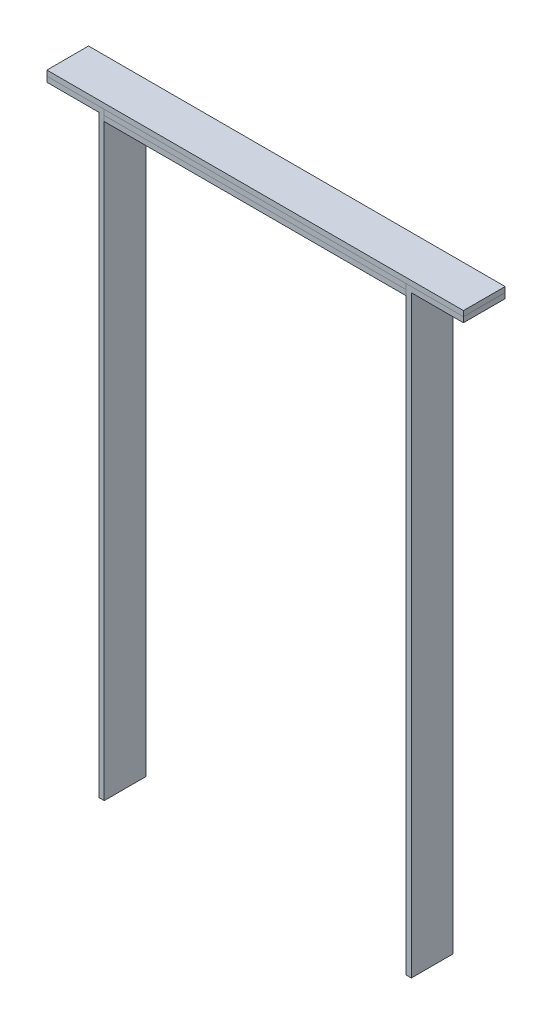
ISO-10303-21;
HEADER;
FILE_DESCRIPTION(('STEP AP214'),'2;1');
FILE_NAME('part.step','',(''),(''),'','','');
FILE_SCHEMA(('AUTOMOTIVE_DESIGN { 1 0 10303 214 1 1 1 1 }'));
ENDSEC;
DATA;
#1=APPLICATION_CONTEXT('core data for automotive mechanical design processes');
#2=APPLICATION_PROTOCOL_DEFINITION('international standard','automotive_design',2000,#1);
#3=PRODUCT_CONTEXT('',#1,'mechanical');
#4=PRODUCT('Part','Part','',(#3));
#5=PRODUCT_RELATED_PRODUCT_CATEGORY('part','',(#4));
#6=PRODUCT_DEFINITION_FORMATION('','',#4);
#7=PRODUCT_DEFINITION_CONTEXT('part definition',#1,'design');
#8=PRODUCT_DEFINITION('design','',#6,#7);
#9=PRODUCT_DEFINITION_SHAPE('','',#8);
#10=(LENGTH_UNIT() NAMED_UNIT(*) SI_UNIT(.MILLI.,.METRE.));
#11=(NAMED_UNIT(*) PLANE_ANGLE_UNIT() SI_UNIT($,.RADIAN.));
#12=(NAMED_UNIT(*) SI_UNIT($,.STERADIAN.) SOLID_ANGLE_UNIT());
#13=UNCERTAINTY_MEASURE_WITH_UNIT(LENGTH_MEASURE(1.E-05),#10,'distance_accuracy_value','');
#14=(GEOMETRIC_REPRESENTATION_CONTEXT(3) GLOBAL_UNCERTAINTY_ASSIGNED_CONTEXT((#13)) GLOBAL_UNIT_ASSIGNED_CONTEXT((#10,
#11,#12)) REPRESENTATION_CONTEXT('',''));
#15=CARTESIAN_POINT('',(0.,0.,0.));
#16=DIRECTION('',(0.,0.,1.));
#17=DIRECTION('',(1.,0.,0.));
#18=AXIS2_PLACEMENT_3D('',#15,#16,#17);
#19=CARTESIAN_POINT('',(1.27,0.,10.));
#20=DIRECTION('',(1.,0.,0.));
#21=DIRECTION('',(0.,1.,0.));
#22=AXIS2_PLACEMENT_3D('',#19,#20,#21);
#23=PLANE('',#22);
#24=DIRECTION('',(0.,-1.,0.));
#25=VECTOR('',#24,1.);
#26=CARTESIAN_POINT('',(1.27,0.,0.));
#27=LINE('',#26,#25);
#28=CARTESIAN_POINT('',(1.26999999999998,142.46,0.));
#29=VERTEX_POINT('',#28);
#30=CARTESIAN_POINT('',(1.26999999999998,141.19,0.));
#31=VERTEX_POINT('',#30);
#32=EDGE_CURVE('E115',#29,#31,#27,.T.);
#33=ORIENTED_EDGE('',*,*,#32,.T.);
#34=DIRECTION('',(0.,0.,-1.));
#35=VECTOR('',#34,1.);
#36=CARTESIAN_POINT('',(1.26999999999998,141.19,10.));
#37=LINE('',#36,#35);
#38=CARTESIAN_POINT('',(1.26999999999998,141.19,10.));
#39=VERTEX_POINT('',#38);
#40=EDGE_CURVE('E12',#39,#31,#37,.T.);
#41=ORIENTED_EDGE('',*,*,#40,.F.);
#42=DIRECTION('',(0.,-1.,0.));
#43=VECTOR('',#42,1.);
#44=CARTESIAN_POINT('',(1.27,0.,10.));
#45=LINE('',#44,#43);
#46=CARTESIAN_POINT('',(1.26999999999998,142.46,10.));
#47=VERTEX_POINT('',#46);
#48=EDGE_CURVE('E101',#47,#39,#45,.T.);
#49=ORIENTED_EDGE('',*,*,#48,.F.);
#50=DIRECTION('',(0.,0.,-1.));
#51=VECTOR('',#50,1.);
#52=CARTESIAN_POINT('',(1.26999999999998,142.46,10.));
#53=LINE('',#52,#51);
#54=EDGE_CURVE('E68',#47,#29,#53,.T.);
#55=ORIENTED_EDGE('',*,*,#54,.T.);
#56=EDGE_LOOP('',(#33,#41,#49,#55));
#57=FACE_BOUND('',#56,.T.);
#58=ADVANCED_FACE('F52',(#57),#23,.F.);
#59=CARTESIAN_POINT('',(0.,141.19,10.));
#60=DIRECTION('',(0.,1.,0.));
#61=DIRECTION('',(0.,0.,1.));
#62=AXIS2_PLACEMENT_3D('',#59,#60,#61);
#63=PLANE('',#62);
#64=DIRECTION('',(1.,0.,0.));
#65=VECTOR('',#64,1.);
#66=CARTESIAN_POINT('',(0.,141.19,0.));
#67=LINE('',#66,#65);
#68=CARTESIAN_POINT('',(73.73,141.19,0.));
#69=VERTEX_POINT('',#68);
#70=EDGE_CURVE('E106',#31,#69,#67,.T.);
#71=ORIENTED_EDGE('',*,*,#70,.T.);
#72=DIRECTION('',(0.,0.,-1.));
#73=VECTOR('',#72,1.);
#74=CARTESIAN_POINT('',(73.73,141.19,10.));
#75=LINE('',#74,#73);
#76=CARTESIAN_POINT('',(73.73,141.19,10.));
#77=VERTEX_POINT('',#76);
#78=EDGE_CURVE('E60',#77,#69,#75,.T.);
#79=ORIENTED_EDGE('',*,*,#78,.F.);
#80=DIRECTION('',(1.,0.,0.));
#81=VECTOR('',#80,1.);
#82=CARTESIAN_POINT('',(0.,141.19,10.));
#83=LINE('',#82,#81);
#84=EDGE_CURVE('E94',#39,#77,#83,.T.);
#85=ORIENTED_EDGE('',*,*,#84,.F.);
#86=ORIENTED_EDGE('',*,*,#40,.T.);
#87=EDGE_LOOP('',(#71,#79,#85,#86));
#88=FACE_BOUND('',#87,.T.);
#89=ADVANCED_FACE('F105',(#88),#63,.F.);
#90=CARTESIAN_POINT('',(73.73,0.,10.));
#91=DIRECTION('',(-1.,0.,0.));
#92=DIRECTION('',(0.,-1.,0.));
#93=AXIS2_PLACEMENT_3D('',#90,#91,#92);
#94=PLANE('',#93);
#95=DIRECTION('',(0.,1.,0.));
#96=VECTOR('',#95,1.);
#97=CARTESIAN_POINT('',(73.73,0.,0.));
#98=LINE('',#97,#96);
#99=CARTESIAN_POINT('',(73.73,142.46,0.));
#100=VERTEX_POINT('',#99);
#101=EDGE_CURVE('E118',#69,#100,#98,.T.);
#102=ORIENTED_EDGE('',*,*,#101,.T.);
#103=DIRECTION('',(0.,0.,-1.));
#104=VECTOR('',#103,1.);
#105=CARTESIAN_POINT('',(73.73,142.46,10.));
#106=LINE('',#105,#104);
#107=CARTESIAN_POINT('',(73.73,142.46,10.));
#108=VERTEX_POINT('',#107);
#109=EDGE_CURVE('E83',#108,#100,#106,.T.);
#110=ORIENTED_EDGE('',*,*,#109,.F.);
#111=DIRECTION('',(0.,1.,0.));
#112=VECTOR('',#111,1.);
#113=CARTESIAN_POINT('',(73.73,0.,10.));
#114=LINE('',#113,#112);
#115=EDGE_CURVE('E100',#77,#108,#114,.T.);
#116=ORIENTED_EDGE('',*,*,#115,.F.);
#117=ORIENTED_EDGE('',*,*,#78,.T.);
#118=EDGE_LOOP('',(#102,#110,#116,#117));
#119=FACE_BOUND('',#118,.T.);
#120=ADVANCED_FACE('F109',(#119),#94,.F.);
#121=CARTESIAN_POINT('',(0.,142.46,10.));
#122=DIRECTION('',(0.,1.,0.));
#123=DIRECTION('',(0.,0.,1.));
#124=AXIS2_PLACEMENT_3D('',#121,#122,#123);
#125=PLANE('',#124);
#126=DIRECTION('',(1.,0.,0.));
#127=VECTOR('',#126,1.);
#128=CARTESIAN_POINT('',(0.,142.46,0.));
#129=LINE('',#128,#127);
#130=EDGE_CURVE('E120',#29,#100,#129,.T.);
#131=ORIENTED_EDGE('',*,*,#130,.F.);
#132=ORIENTED_EDGE('',*,*,#54,.F.);
#133=DIRECTION('',(1.,0.,0.));
#134=VECTOR('',#133,1.);
#135=CARTESIAN_POINT('',(0.,142.46,10.));
#136=LINE('',#135,#134);
#137=EDGE_CURVE('E110',#47,#108,#136,.T.);
#138=ORIENTED_EDGE('',*,*,#137,.T.);
#139=ORIENTED_EDGE('',*,*,#109,.T.);
#140=EDGE_LOOP('',(#131,#132,#138,#139));
#141=FACE_BOUND('',#140,.T.);
#142=ADVANCED_FACE('F126',(#141),#125,.T.);
#143=CARTESIAN_POINT('',(0.,0.,10.));
#144=DIRECTION('',(0.,0.,1.));
#145=DIRECTION('',(1.,0.,0.));
#146=AXIS2_PLACEMENT_3D('',#143,#144,#145);
#147=PLANE('',#146);
#148=ORIENTED_EDGE('',*,*,#48,.T.);
#149=ORIENTED_EDGE('',*,*,#84,.T.);
#150=ORIENTED_EDGE('',*,*,#115,.T.);
#151=ORIENTED_EDGE('',*,*,#137,.F.);
#152=EDGE_LOOP('',(#148,#149,#150,#151));
#153=FACE_BOUND('',#152,.T.);
#154=ADVANCED_FACE('F97',(#153),#147,.T.);
#155=CARTESIAN_POINT('',(0.,0.,0.));
#156=DIRECTION('',(0.,0.,1.));
#157=DIRECTION('',(1.,0.,0.));
#158=AXIS2_PLACEMENT_3D('',#155,#156,#157);
#159=PLANE('',#158);
#160=ORIENTED_EDGE('',*,*,#32,.F.);
#161=ORIENTED_EDGE('',*,*,#130,.T.);
#162=ORIENTED_EDGE('',*,*,#101,.F.);
#163=ORIENTED_EDGE('',*,*,#70,.F.);
#164=EDGE_LOOP('',(#160,#161,#162,#163));
#165=FACE_BOUND('',#164,.T.);
#166=ADVANCED_FACE('F125',(#165),#159,.F.);
#167=CLOSED_SHELL('',(#58,#89,#120,#142,#154,#166));
#168=MANIFOLD_SOLID_BREP('B2',#167);
#169=CARTESIAN_POINT('',(0.,143.73,10.));
#170=DIRECTION('',(0.,-1.,0.));
#171=DIRECTION('',(0.,0.,-1.));
#172=AXIS2_PLACEMENT_3D('',#169,#170,#171);
#173=PLANE('',#172);
#174=DIRECTION('',(-1.,0.,0.));
#175=VECTOR('',#174,1.);
#176=CARTESIAN_POINT('',(0.,143.73,0.));
#177=LINE('',#176,#175);
#178=CARTESIAN_POINT('',(87.5,143.73,0.));
#179=VERTEX_POINT('',#178);
#180=CARTESIAN_POINT('',(-12.5,143.73,0.));
#181=VERTEX_POINT('',#180);
#182=EDGE_CURVE('E258',#179,#181,#177,.T.);
#183=ORIENTED_EDGE('',*,*,#182,.F.);
#184=DIRECTION('',(0.,0.,-1.));
#185=VECTOR('',#184,1.);
#186=CARTESIAN_POINT('',(87.5,143.73,10.));
#187=LINE('',#186,#185);
#188=CARTESIAN_POINT('',(87.5,143.73,10.));
#189=VERTEX_POINT('',#188);
#190=EDGE_CURVE('E50',#189,#179,#187,.T.);
#191=ORIENTED_EDGE('',*,*,#190,.F.);
#192=DIRECTION('',(-1.,0.,0.));
#193=VECTOR('',#192,1.);
#194=CARTESIAN_POINT('',(0.,143.73,10.));
#195=LINE('',#194,#193);
#196=CARTESIAN_POINT('',(-12.5,143.73,10.));
#197=VERTEX_POINT('',#196);
#198=EDGE_CURVE('E250',#189,#197,#195,.T.);
#199=ORIENTED_EDGE('',*,*,#198,.T.);
#200=DIRECTION('',(0.,0.,-1.));
#201=VECTOR('',#200,1.);
#202=CARTESIAN_POINT('',(-12.5,143.73,10.));
#203=LINE('',#202,#201);
#204=EDGE_CURVE('E211',#197,#181,#203,.T.);
#205=ORIENTED_EDGE('',*,*,#204,.T.);
#206=EDGE_LOOP('',(#183,#191,#199,#205));
#207=FACE_BOUND('',#206,.T.);
#208=ADVANCED_FACE('F195',(#207),#173,.T.);
#209=CARTESIAN_POINT('',(87.5,0.,10.));
#210=DIRECTION('',(1.,0.,0.));
#211=DIRECTION('',(0.,0.,-1.));
#212=AXIS2_PLACEMENT_3D('',#209,#210,#211);
#213=PLANE('',#212);
#214=DIRECTION('',(0.,-1.,0.));
#215=VECTOR('',#214,1.);
#216=CARTESIAN_POINT('',(87.5,0.,0.));
#217=LINE('',#216,#215);
#218=CARTESIAN_POINT('',(87.5,145.,0.));
#219=VERTEX_POINT('',#218);
#220=EDGE_CURVE('E241',#219,#179,#217,.T.);
#221=ORIENTED_EDGE('',*,*,#220,.F.);
#222=DIRECTION('',(0.,0.,-1.));
#223=VECTOR('',#222,1.);
#224=CARTESIAN_POINT('',(87.5,145.,10.));
#225=LINE('',#224,#223);
#226=CARTESIAN_POINT('',(87.5,145.,10.));
#227=VERTEX_POINT('',#226);
#228=EDGE_CURVE('E203',#227,#219,#225,.T.);
#229=ORIENTED_EDGE('',*,*,#228,.F.);
#230=DIRECTION('',(0.,-1.,0.));
#231=VECTOR('',#230,1.);
#232=CARTESIAN_POINT('',(87.5,0.,10.));
#233=LINE('',#232,#231);
#234=EDGE_CURVE('E239',#227,#189,#233,.T.);
#235=ORIENTED_EDGE('',*,*,#234,.T.);
#236=ORIENTED_EDGE('',*,*,#190,.T.);
#237=EDGE_LOOP('',(#221,#229,#235,#236));
#238=FACE_BOUND('',#237,.T.);
#239=ADVANCED_FACE('F238',(#238),#213,.T.);
#240=CARTESIAN_POINT('',(0.,145.,10.));
#241=DIRECTION('',(0.,1.,0.));
#242=DIRECTION('',(0.,0.,1.));
#243=AXIS2_PLACEMENT_3D('',#240,#241,#242);
#244=PLANE('',#243);
#245=DIRECTION('',(1.,0.,0.));
#246=VECTOR('',#245,1.);
#247=CARTESIAN_POINT('',(0.,145.,0.));
#248=LINE('',#247,#246);
#249=CARTESIAN_POINT('',(-12.5,145.,0.));
#250=VERTEX_POINT('',#249);
#251=EDGE_CURVE('E261',#250,#219,#248,.T.);
#252=ORIENTED_EDGE('',*,*,#251,.F.);
#253=DIRECTION('',(0.,0.,-1.));
#254=VECTOR('',#253,1.);
#255=CARTESIAN_POINT('',(-12.5,145.,10.));
#256=LINE('',#255,#254);
#257=CARTESIAN_POINT('',(-12.5,145.,10.));
#258=VERTEX_POINT('',#257);
#259=EDGE_CURVE('E224',#258,#250,#256,.T.);
#260=ORIENTED_EDGE('',*,*,#259,.F.);
#261=DIRECTION('',(1.,0.,0.));
#262=VECTOR('',#261,1.);
#263=CARTESIAN_POINT('',(0.,145.,10.));
#264=LINE('',#263,#262);
#265=EDGE_CURVE('E249',#258,#227,#264,.T.);
#266=ORIENTED_EDGE('',*,*,#265,.T.);
#267=ORIENTED_EDGE('',*,*,#228,.T.);
#268=EDGE_LOOP('',(#252,#260,#266,#267));
#269=FACE_BOUND('',#268,.T.);
#270=ADVANCED_FACE('F252',(#269),#244,.T.);
#271=CARTESIAN_POINT('',(-12.5,0.,10.));
#272=DIRECTION('',(-1.,0.,0.));
#273=DIRECTION('',(0.,0.,1.));
#274=AXIS2_PLACEMENT_3D('',#271,#272,#273);
#275=PLANE('',#274);
#276=DIRECTION('',(0.,1.,0.));
#277=VECTOR('',#276,1.);
#278=CARTESIAN_POINT('',(-12.5,0.,0.));
#279=LINE('',#278,#277);
#280=EDGE_CURVE('E263',#181,#250,#279,.T.);
#281=ORIENTED_EDGE('',*,*,#280,.F.);
#282=ORIENTED_EDGE('',*,*,#204,.F.);
#283=DIRECTION('',(0.,1.,0.));
#284=VECTOR('',#283,1.);
#285=CARTESIAN_POINT('',(-12.5,0.,10.));
#286=LINE('',#285,#284);
#287=EDGE_CURVE('E253',#197,#258,#286,.T.);
#288=ORIENTED_EDGE('',*,*,#287,.T.);
#289=ORIENTED_EDGE('',*,*,#259,.T.);
#290=EDGE_LOOP('',(#281,#282,#288,#289));
#291=FACE_BOUND('',#290,.T.);
#292=ADVANCED_FACE('F268',(#291),#275,.T.);
#293=CARTESIAN_POINT('',(0.,0.,10.));
#294=DIRECTION('',(0.,0.,1.));
#295=DIRECTION('',(1.,0.,0.));
#296=AXIS2_PLACEMENT_3D('',#293,#294,#295);
#297=PLANE('',#296);
#298=ORIENTED_EDGE('',*,*,#198,.F.);
#299=ORIENTED_EDGE('',*,*,#234,.F.);
#300=ORIENTED_EDGE('',*,*,#265,.F.);
#301=ORIENTED_EDGE('',*,*,#287,.F.);
#302=EDGE_LOOP('',(#298,#299,#300,#301));
#303=FACE_BOUND('',#302,.T.);
#304=ADVANCED_FACE('F247',(#303),#297,.T.);
#305=CARTESIAN_POINT('',(0.,0.,0.));
#306=DIRECTION('',(0.,0.,1.));
#307=DIRECTION('',(1.,0.,0.));
#308=AXIS2_PLACEMENT_3D('',#305,#306,#307);
#309=PLANE('',#308);
#310=ORIENTED_EDGE('',*,*,#182,.T.);
#311=ORIENTED_EDGE('',*,*,#280,.T.);
#312=ORIENTED_EDGE('',*,*,#251,.T.);
#313=ORIENTED_EDGE('',*,*,#220,.T.);
#314=EDGE_LOOP('',(#310,#311,#312,#313));
#315=FACE_BOUND('',#314,.T.);
#316=ADVANCED_FACE('F275',(#315),#309,.F.);
#317=CLOSED_SHELL('',(#208,#239,#270,#292,#304,#316));
#318=MANIFOLD_SOLID_BREP('B6',#317);
#319=CARTESIAN_POINT('',(1.27,0.,10.));
#320=DIRECTION('',(1.,0.,0.));
#321=DIRECTION('',(0.,1.,0.));
#322=AXIS2_PLACEMENT_3D('',#319,#320,#321);
#323=PLANE('',#322);
#324=DIRECTION('',(0.,-1.,0.));
#325=VECTOR('',#324,1.);
#326=CARTESIAN_POINT('',(1.27,0.,0.));
#327=LINE('',#326,#325);
#328=CARTESIAN_POINT('',(1.26999999999998,143.73,0.));
#329=VERTEX_POINT('',#328);
#330=CARTESIAN_POINT('',(1.26999999999998,142.46,0.));
#331=VERTEX_POINT('',#330);
#332=EDGE_CURVE('E401',#329,#331,#327,.T.);
#333=ORIENTED_EDGE('',*,*,#332,.T.);
#334=DIRECTION('',(0.,0.,-1.));
#335=VECTOR('',#334,1.);
#336=CARTESIAN_POINT('',(1.26999999999998,142.46,10.));
#337=LINE('',#336,#335);
#338=CARTESIAN_POINT('',(1.26999999999998,142.46,10.));
#339=VERTEX_POINT('',#338);
#340=EDGE_CURVE('E193',#339,#331,#337,.T.);
#341=ORIENTED_EDGE('',*,*,#340,.F.);
#342=DIRECTION('',(0.,-1.,0.));
#343=VECTOR('',#342,1.);
#344=CARTESIAN_POINT('',(1.27,0.,10.));
#345=LINE('',#344,#343);
#346=CARTESIAN_POINT('',(1.26999999999998,143.73,10.));
#347=VERTEX_POINT('',#346);
#348=EDGE_CURVE('E389',#347,#339,#345,.T.);
#349=ORIENTED_EDGE('',*,*,#348,.F.);
#350=DIRECTION('',(0.,0.,-1.));
#351=VECTOR('',#350,1.);
#352=CARTESIAN_POINT('',(1.26999999999998,143.73,10.));
#353=LINE('',#352,#351);
#354=EDGE_CURVE('E397',#347,#329,#353,.T.);
#355=ORIENTED_EDGE('',*,*,#354,.T.);
#356=EDGE_LOOP('',(#333,#341,#349,#355));
#357=FACE_BOUND('',#356,.T.);
#358=ADVANCED_FACE('F338',(#357),#323,.F.);
#359=CARTESIAN_POINT('',(0.,142.46,10.));
#360=DIRECTION('',(0.,1.,0.));
#361=DIRECTION('',(0.,0.,1.));
#362=AXIS2_PLACEMENT_3D('',#359,#360,#361);
#363=PLANE('',#362);
#364=DIRECTION('',(1.,0.,0.));
#365=VECTOR('',#364,1.);
#366=CARTESIAN_POINT('',(0.,142.46,0.));
#367=LINE('',#366,#365);
#368=CARTESIAN_POINT('',(73.73,142.46,0.));
#369=VERTEX_POINT('',#368);
#370=EDGE_CURVE('E393',#331,#369,#367,.T.);
#371=ORIENTED_EDGE('',*,*,#370,.T.);
#372=DIRECTION('',(0.,0.,-1.));
#373=VECTOR('',#372,1.);
#374=CARTESIAN_POINT('',(73.73,142.46,10.));
#375=LINE('',#374,#373);
#376=CARTESIAN_POINT('',(73.73,142.46,10.));
#377=VERTEX_POINT('',#376);
#378=EDGE_CURVE('E346',#377,#369,#375,.T.);
#379=ORIENTED_EDGE('',*,*,#378,.F.);
#380=DIRECTION('',(1.,0.,0.));
#381=VECTOR('',#380,1.);
#382=CARTESIAN_POINT('',(0.,142.46,10.));
#383=LINE('',#382,#381);
#384=EDGE_CURVE('E384',#339,#377,#383,.T.);
#385=ORIENTED_EDGE('',*,*,#384,.F.);
#386=ORIENTED_EDGE('',*,*,#340,.T.);
#387=EDGE_LOOP('',(#371,#379,#385,#386));
#388=FACE_BOUND('',#387,.T.);
#389=ADVANCED_FACE('F392',(#388),#363,.F.);
#390=CARTESIAN_POINT('',(73.73,0.,10.));
#391=DIRECTION('',(-1.,0.,0.));
#392=DIRECTION('',(0.,-1.,0.));
#393=AXIS2_PLACEMENT_3D('',#390,#391,#392);
#394=PLANE('',#393);
#395=DIRECTION('',(0.,1.,0.));
#396=VECTOR('',#395,1.);
#397=CARTESIAN_POINT('',(73.73,0.,0.));
#398=LINE('',#397,#396);
#399=CARTESIAN_POINT('',(73.73,143.73,0.));
#400=VERTEX_POINT('',#399);
#401=EDGE_CURVE('E371',#369,#400,#398,.T.);
#402=ORIENTED_EDGE('',*,*,#401,.T.);
#403=DIRECTION('',(0.,0.,-1.));
#404=VECTOR('',#403,1.);
#405=CARTESIAN_POINT('',(73.73,143.73,10.));
#406=LINE('',#405,#404);
#407=CARTESIAN_POINT('',(73.73,143.73,10.));
#408=VERTEX_POINT('',#407);
#409=EDGE_CURVE('E394',#408,#400,#406,.T.);
#410=ORIENTED_EDGE('',*,*,#409,.F.);
#411=DIRECTION('',(0.,1.,0.));
#412=VECTOR('',#411,1.);
#413=CARTESIAN_POINT('',(73.73,0.,10.));
#414=LINE('',#413,#412);
#415=EDGE_CURVE('E387',#377,#408,#414,.T.);
#416=ORIENTED_EDGE('',*,*,#415,.F.);
#417=ORIENTED_EDGE('',*,*,#378,.T.);
#418=EDGE_LOOP('',(#402,#410,#416,#417));
#419=FACE_BOUND('',#418,.T.);
#420=ADVANCED_FACE('F395',(#419),#394,.F.);
#421=CARTESIAN_POINT('',(0.,143.73,10.));
#422=DIRECTION('',(0.,-1.,0.));
#423=DIRECTION('',(0.,0.,-1.));
#424=AXIS2_PLACEMENT_3D('',#421,#422,#423);
#425=PLANE('',#424);
#426=DIRECTION('',(-1.,0.,0.));
#427=VECTOR('',#426,1.);
#428=CARTESIAN_POINT('',(0.,143.73,0.));
#429=LINE('',#428,#427);
#430=EDGE_CURVE('E377',#400,#329,#429,.T.);
#431=ORIENTED_EDGE('',*,*,#430,.T.);
#432=ORIENTED_EDGE('',*,*,#354,.F.);
#433=DIRECTION('',(-1.,0.,0.));
#434=VECTOR('',#433,1.);
#435=CARTESIAN_POINT('',(0.,143.73,10.));
#436=LINE('',#435,#434);
#437=EDGE_CURVE('E354',#408,#347,#436,.T.);
#438=ORIENTED_EDGE('',*,*,#437,.F.);
#439=ORIENTED_EDGE('',*,*,#409,.T.);
#440=EDGE_LOOP('',(#431,#432,#438,#439));
#441=FACE_BOUND('',#440,.T.);
#442=ADVANCED_FACE('F408',(#441),#425,.F.);
#443=CARTESIAN_POINT('',(0.,0.,10.));
#444=DIRECTION('',(0.,0.,1.));
#445=DIRECTION('',(1.,0.,0.));
#446=AXIS2_PLACEMENT_3D('',#443,#444,#445);
#447=PLANE('',#446);
#448=ORIENTED_EDGE('',*,*,#348,.T.);
#449=ORIENTED_EDGE('',*,*,#384,.T.);
#450=ORIENTED_EDGE('',*,*,#415,.T.);
#451=ORIENTED_EDGE('',*,*,#437,.T.);
#452=EDGE_LOOP('',(#448,#449,#450,#451));
#453=FACE_BOUND('',#452,.T.);
#454=ADVANCED_FACE('F385',(#453),#447,.T.);
#455=CARTESIAN_POINT('',(0.,0.,0.));
#456=DIRECTION('',(0.,0.,1.));
#457=DIRECTION('',(1.,0.,0.));
#458=AXIS2_PLACEMENT_3D('',#455,#456,#457);
#459=PLANE('',#458);
#460=ORIENTED_EDGE('',*,*,#332,.F.);
#461=ORIENTED_EDGE('',*,*,#430,.F.);
#462=ORIENTED_EDGE('',*,*,#401,.F.);
#463=ORIENTED_EDGE('',*,*,#370,.F.);
#464=EDGE_LOOP('',(#460,#461,#462,#463));
#465=FACE_BOUND('',#464,.T.);
#466=ADVANCED_FACE('F411',(#465),#459,.F.);
#467=CLOSED_SHELL('',(#358,#389,#420,#442,#454,#466));
#468=MANIFOLD_SOLID_BREP('B44',#467);
#469=CARTESIAN_POINT('',(73.73,0.,10.));
#470=DIRECTION('',(-1.,0.,0.));
#471=DIRECTION('',(0.,-1.,0.));
#472=AXIS2_PLACEMENT_3D('',#469,#470,#471);
#473=PLANE('',#472);
#474=DIRECTION('',(0.,1.,0.));
#475=VECTOR('',#474,1.);
#476=CARTESIAN_POINT('',(73.73,0.,0.));
#477=LINE('',#476,#475);
#478=CARTESIAN_POINT('',(73.73,0.,0.));
#479=VERTEX_POINT('',#478);
#480=CARTESIAN_POINT('',(73.73,143.73,0.));
#481=VERTEX_POINT('',#480);
#482=EDGE_CURVE('E564',#479,#481,#477,.T.);
#483=ORIENTED_EDGE('',*,*,#482,.F.);
#484=DIRECTION('',(0.,0.,-1.));
#485=VECTOR('',#484,1.);
#486=CARTESIAN_POINT('',(73.73,0.,10.));
#487=LINE('',#486,#485);
#488=CARTESIAN_POINT('',(73.73,0.,10.));
#489=VERTEX_POINT('',#488);
#490=EDGE_CURVE('E336',#489,#479,#487,.T.);
#491=ORIENTED_EDGE('',*,*,#490,.F.);
#492=DIRECTION('',(0.,1.,0.));
#493=VECTOR('',#492,1.);
#494=CARTESIAN_POINT('',(73.73,0.,10.));
#495=LINE('',#494,#493);
#496=CARTESIAN_POINT('',(73.73,143.73,10.));
#497=VERTEX_POINT('',#496);
#498=EDGE_CURVE('E578',#489,#497,#495,.T.);
#499=ORIENTED_EDGE('',*,*,#498,.T.);
#500=DIRECTION('',(0.,0.,-1.));
#501=VECTOR('',#500,1.);
#502=CARTESIAN_POINT('',(73.73,143.73,10.));
#503=LINE('',#502,#501);
#504=EDGE_CURVE('E527',#497,#481,#503,.T.);
#505=ORIENTED_EDGE('',*,*,#504,.T.);
#506=EDGE_LOOP('',(#483,#491,#499,#505));
#507=FACE_BOUND('',#506,.T.);
#508=ADVANCED_FACE('F483',(#507),#473,.T.);
#509=CARTESIAN_POINT('',(0.,-1.9080239131939E-13,10.));
#510=DIRECTION('',(0.,-1.,0.));
#511=DIRECTION('',(1.,0.,0.));
#512=AXIS2_PLACEMENT_3D('',#509,#510,#511);
#513=PLANE('',#512);
#514=DIRECTION('',(-1.,0.,0.));
#515=VECTOR('',#514,1.);
#516=CARTESIAN_POINT('',(0.,-1.9080239131939E-13,0.));
#517=LINE('',#516,#515);
#518=CARTESIAN_POINT('',(75.,0.,0.));
#519=VERTEX_POINT('',#518);
#520=EDGE_CURVE('E567',#519,#479,#517,.T.);
#521=ORIENTED_EDGE('',*,*,#520,.F.);
#522=DIRECTION('',(0.,0.,-1.));
#523=VECTOR('',#522,1.);
#524=CARTESIAN_POINT('',(75.,0.,10.));
#525=LINE('',#524,#523);
#526=CARTESIAN_POINT('',(75.,0.,10.));
#527=VERTEX_POINT('',#526);
#528=EDGE_CURVE('E491',#527,#519,#525,.T.);
#529=ORIENTED_EDGE('',*,*,#528,.F.);
#530=DIRECTION('',(-1.,0.,0.));
#531=VECTOR('',#530,1.);
#532=CARTESIAN_POINT('',(0.,-1.9080239131939E-13,10.));
#533=LINE('',#532,#531);
#534=EDGE_CURVE('E591',#527,#489,#533,.T.);
#535=ORIENTED_EDGE('',*,*,#534,.T.);
#536=ORIENTED_EDGE('',*,*,#490,.T.);
#537=EDGE_LOOP('',(#521,#529,#535,#536));
#538=FACE_BOUND('',#537,.T.);
#539=ADVANCED_FACE('F587',(#538),#513,.T.);
#540=CARTESIAN_POINT('',(75.,0.,10.));
#541=DIRECTION('',(1.,0.,0.));
#542=DIRECTION('',(0.,0.,-1.));
#543=AXIS2_PLACEMENT_3D('',#540,#541,#542);
#544=PLANE('',#543);
#545=DIRECTION('',(0.,-1.,0.));
#546=VECTOR('',#545,1.);
#547=CARTESIAN_POINT('',(75.,0.,0.));
#548=LINE('',#547,#546);
#549=CARTESIAN_POINT('',(75.,142.46,0.));
#550=VERTEX_POINT('',#549);
#551=EDGE_CURVE('E570',#550,#519,#548,.T.);
#552=ORIENTED_EDGE('',*,*,#551,.F.);
#553=DIRECTION('',(0.,0.,-1.));
#554=VECTOR('',#553,1.);
#555=CARTESIAN_POINT('',(75.,142.46,10.));
#556=LINE('',#555,#554);
#557=CARTESIAN_POINT('',(75.,142.46,10.));
#558=VERTEX_POINT('',#557);
#559=EDGE_CURVE('E550',#558,#550,#556,.T.);
#560=ORIENTED_EDGE('',*,*,#559,.F.);
#561=DIRECTION('',(0.,-1.,0.));
#562=VECTOR('',#561,1.);
#563=CARTESIAN_POINT('',(75.,0.,10.));
#564=LINE('',#563,#562);
#565=EDGE_CURVE('E557',#558,#527,#564,.T.);
#566=ORIENTED_EDGE('',*,*,#565,.T.);
#567=ORIENTED_EDGE('',*,*,#528,.T.);
#568=EDGE_LOOP('',(#552,#560,#566,#567));
#569=FACE_BOUND('',#568,.T.);
#570=ADVANCED_FACE('F584',(#569),#544,.T.);
#571=CARTESIAN_POINT('',(0.,142.46,10.));
#572=DIRECTION('',(0.,-1.,0.));
#573=DIRECTION('',(0.,0.,-1.));
#574=AXIS2_PLACEMENT_3D('',#571,#572,#573);
#575=PLANE('',#574);
#576=DIRECTION('',(-1.,0.,0.));
#577=VECTOR('',#576,1.);
#578=CARTESIAN_POINT('',(0.,142.46,0.));
#579=LINE('',#578,#577);
#580=CARTESIAN_POINT('',(87.5,142.46,0.));
#581=VERTEX_POINT('',#580);
#582=EDGE_CURVE('E545',#581,#550,#579,.T.);
#583=ORIENTED_EDGE('',*,*,#582,.F.);
#584=DIRECTION('',(0.,0.,-1.));
#585=VECTOR('',#584,1.);
#586=CARTESIAN_POINT('',(87.5,142.46,10.));
#587=LINE('',#586,#585);
#588=CARTESIAN_POINT('',(87.5,142.46,10.));
#589=VERTEX_POINT('',#588);
#590=EDGE_CURVE('E540',#589,#581,#587,.T.);
#591=ORIENTED_EDGE('',*,*,#590,.F.);
#592=DIRECTION('',(-1.,0.,0.));
#593=VECTOR('',#592,1.);
#594=CARTESIAN_POINT('',(0.,142.46,10.));
#595=LINE('',#594,#593);
#596=EDGE_CURVE('E543',#589,#558,#595,.T.);
#597=ORIENTED_EDGE('',*,*,#596,.T.);
#598=ORIENTED_EDGE('',*,*,#559,.T.);
#599=EDGE_LOOP('',(#583,#591,#597,#598));
#600=FACE_BOUND('',#599,.T.);
#601=ADVANCED_FACE('F542',(#600),#575,.T.);
#602=CARTESIAN_POINT('',(87.4999999999984,-9.5614679778248E-13,10.));
#603=DIRECTION('',(1.,0.,0.));
#604=DIRECTION('',(0.,1.,0.));
#605=AXIS2_PLACEMENT_3D('',#602,#603,#604);
#606=PLANE('',#605);
#607=DIRECTION('',(0.,-1.,0.));
#608=VECTOR('',#607,1.);
#609=CARTESIAN_POINT('',(87.4999999999984,-9.5614679778248E-13,0.));
#610=LINE('',#609,#608);
#611=CARTESIAN_POINT('',(87.5,143.73,0.));
#612=VERTEX_POINT('',#611);
#613=EDGE_CURVE('E574',#612,#581,#610,.T.);
#614=ORIENTED_EDGE('',*,*,#613,.F.);
#615=DIRECTION('',(0.,0.,-1.));
#616=VECTOR('',#615,1.);
#617=CARTESIAN_POINT('',(87.5,143.73,10.));
#618=LINE('',#617,#616);
#619=CARTESIAN_POINT('',(87.5,143.73,10.));
#620=VERTEX_POINT('',#619);
#621=EDGE_CURVE('E520',#620,#612,#618,.T.);
#622=ORIENTED_EDGE('',*,*,#621,.F.);
#623=DIRECTION('',(0.,-1.,0.));
#624=VECTOR('',#623,1.);
#625=CARTESIAN_POINT('',(87.4999999999984,-9.5614679778248E-13,10.));
#626=LINE('',#625,#624);
#627=EDGE_CURVE('E554',#620,#589,#626,.T.);
#628=ORIENTED_EDGE('',*,*,#627,.T.);
#629=ORIENTED_EDGE('',*,*,#590,.T.);
#630=EDGE_LOOP('',(#614,#622,#628,#629));
#631=FACE_BOUND('',#630,.T.);
#632=ADVANCED_FACE('F559',(#631),#606,.T.);
#633=CARTESIAN_POINT('',(0.,143.73,10.));
#634=DIRECTION('',(0.,-1.,0.));
#635=DIRECTION('',(0.,0.,-1.));
#636=AXIS2_PLACEMENT_3D('',#633,#634,#635);
#637=PLANE('',#636);
#638=DIRECTION('',(-1.,0.,0.));
#639=VECTOR('',#638,1.);
#640=CARTESIAN_POINT('',(0.,143.73,0.));
#641=LINE('',#640,#639);
#642=EDGE_CURVE('E576',#612,#481,#641,.T.);
#643=ORIENTED_EDGE('',*,*,#642,.T.);
#644=ORIENTED_EDGE('',*,*,#504,.F.);
#645=DIRECTION('',(-1.,0.,0.));
#646=VECTOR('',#645,1.);
#647=CARTESIAN_POINT('',(0.,143.73,10.));
#648=LINE('',#647,#646);
#649=EDGE_CURVE('E499',#620,#497,#648,.T.);
#650=ORIENTED_EDGE('',*,*,#649,.F.);
#651=ORIENTED_EDGE('',*,*,#621,.T.);
#652=EDGE_LOOP('',(#643,#644,#650,#651));
#653=FACE_BOUND('',#652,.T.);
#654=ADVANCED_FACE('F590',(#653),#637,.F.);
#655=CARTESIAN_POINT('',(0.,0.,10.));
#656=DIRECTION('',(0.,0.,1.));
#657=DIRECTION('',(1.,0.,0.));
#658=AXIS2_PLACEMENT_3D('',#655,#656,#657);
#659=PLANE('',#658);
#660=ORIENTED_EDGE('',*,*,#498,.F.);
#661=ORIENTED_EDGE('',*,*,#534,.F.);
#662=ORIENTED_EDGE('',*,*,#565,.F.);
#663=ORIENTED_EDGE('',*,*,#596,.F.);
#664=ORIENTED_EDGE('',*,*,#627,.F.);
#665=ORIENTED_EDGE('',*,*,#649,.T.);
#666=EDGE_LOOP('',(#660,#661,#662,#663,#664,#665));
#667=FACE_BOUND('',#666,.T.);
#668=ADVANCED_FACE('F553',(#667),#659,.T.);
#669=CARTESIAN_POINT('',(0.,0.,0.));
#670=DIRECTION('',(0.,0.,1.));
#671=DIRECTION('',(1.,0.,0.));
#672=AXIS2_PLACEMENT_3D('',#669,#670,#671);
#673=PLANE('',#672);
#674=ORIENTED_EDGE('',*,*,#482,.T.);
#675=ORIENTED_EDGE('',*,*,#642,.F.);
#676=ORIENTED_EDGE('',*,*,#613,.T.);
#677=ORIENTED_EDGE('',*,*,#582,.T.);
#678=ORIENTED_EDGE('',*,*,#551,.T.);
#679=ORIENTED_EDGE('',*,*,#520,.T.);
#680=EDGE_LOOP('',(#674,#675,#676,#677,#678,#679));
#681=FACE_BOUND('',#680,.T.);
#682=ADVANCED_FACE('F589',(#681),#673,.F.);
#683=CLOSED_SHELL('',(#508,#539,#570,#601,#632,#654,#668,#682));
#684=MANIFOLD_SOLID_BREP('B187',#683);
#685=CARTESIAN_POINT('',(0.,0.,10.));
#686=DIRECTION('',(0.,-1.,0.));
#687=DIRECTION('',(1.,0.,0.));
#688=AXIS2_PLACEMENT_3D('',#685,#686,#687);
#689=PLANE('',#688);
#690=DIRECTION('',(-1.,0.,0.));
#691=VECTOR('',#690,1.);
#692=CARTESIAN_POINT('',(0.,0.,0.));
#693=LINE('',#692,#691);
#694=CARTESIAN_POINT('',(1.27,0.,0.));
#695=VERTEX_POINT('',#694);
#696=CARTESIAN_POINT('',(0.,0.,0.));
#697=VERTEX_POINT('',#696);
#698=EDGE_CURVE('E749',#695,#697,#693,.T.);
#699=ORIENTED_EDGE('',*,*,#698,.F.);
#700=DIRECTION('',(0.,0.,-1.));
#701=VECTOR('',#700,1.);
#702=CARTESIAN_POINT('',(1.27,0.,10.));
#703=LINE('',#702,#701);
#704=CARTESIAN_POINT('',(1.27,0.,10.));
#705=VERTEX_POINT('',#704);
#706=EDGE_CURVE('E481',#705,#695,#703,.T.);
#707=ORIENTED_EDGE('',*,*,#706,.F.);
#708=DIRECTION('',(-1.,0.,0.));
#709=VECTOR('',#708,1.);
#710=CARTESIAN_POINT('',(0.,0.,10.));
#711=LINE('',#710,#709);
#712=CARTESIAN_POINT('',(0.,0.,10.));
#713=VERTEX_POINT('',#712);
#714=EDGE_CURVE('E763',#705,#713,#711,.T.);
#715=ORIENTED_EDGE('',*,*,#714,.T.);
#716=DIRECTION('',(0.,0.,-1.));
#717=VECTOR('',#716,1.);
#718=CARTESIAN_POINT('',(0.,0.,10.));
#719=LINE('',#718,#717);
#720=EDGE_CURVE('E684',#713,#697,#719,.T.);
#721=ORIENTED_EDGE('',*,*,#720,.T.);
#722=EDGE_LOOP('',(#699,#707,#715,#721));
#723=FACE_BOUND('',#722,.T.);
#724=ADVANCED_FACE('F668',(#723),#689,.T.);
#725=CARTESIAN_POINT('',(1.27,0.,10.));
#726=DIRECTION('',(1.,0.,0.));
#727=DIRECTION('',(0.,1.,0.));
#728=AXIS2_PLACEMENT_3D('',#725,#726,#727);
#729=PLANE('',#728);
#730=DIRECTION('',(0.,-1.,0.));
#731=VECTOR('',#730,1.);
#732=CARTESIAN_POINT('',(1.27,0.,0.));
#733=LINE('',#732,#731);
#734=CARTESIAN_POINT('',(1.26999999999998,143.73,0.));
#735=VERTEX_POINT('',#734);
#736=EDGE_CURVE('E751',#735,#695,#733,.T.);
#737=ORIENTED_EDGE('',*,*,#736,.F.);
#738=DIRECTION('',(0.,0.,-1.));
#739=VECTOR('',#738,1.);
#740=CARTESIAN_POINT('',(1.26999999999998,143.73,10.));
#741=LINE('',#740,#739);
#742=CARTESIAN_POINT('',(1.26999999999998,143.73,10.));
#743=VERTEX_POINT('',#742);
#744=EDGE_CURVE('E676',#743,#735,#741,.T.);
#745=ORIENTED_EDGE('',*,*,#744,.F.);
#746=DIRECTION('',(0.,-1.,0.));
#747=VECTOR('',#746,1.);
#748=CARTESIAN_POINT('',(1.27,0.,10.));
#749=LINE('',#748,#747);
#750=EDGE_CURVE('E847',#743,#705,#749,.T.);
#751=ORIENTED_EDGE('',*,*,#750,.T.);
#752=ORIENTED_EDGE('',*,*,#706,.T.);
#753=EDGE_LOOP('',(#737,#745,#751,#752));
#754=FACE_BOUND('',#753,.T.);
#755=ADVANCED_FACE('F772',(#754),#729,.T.);
#756=CARTESIAN_POINT('',(0.,143.73,10.));
#757=DIRECTION('',(0.,1.,0.));
#758=DIRECTION('',(0.,0.,1.));
#759=AXIS2_PLACEMENT_3D('',#756,#757,#758);
#760=PLANE('',#759);
#761=DIRECTION('',(1.,0.,0.));
#762=VECTOR('',#761,1.);
#763=CARTESIAN_POINT('',(0.,143.73,0.));
#764=LINE('',#763,#762);
#765=CARTESIAN_POINT('',(-12.5,143.73,0.));
#766=VERTEX_POINT('',#765);
#767=EDGE_CURVE('E754',#766,#735,#764,.T.);
#768=ORIENTED_EDGE('',*,*,#767,.F.);
#769=DIRECTION('',(0.,0.,-1.));
#770=VECTOR('',#769,1.);
#771=CARTESIAN_POINT('',(-12.5,143.73,10.));
#772=LINE('',#771,#770);
#773=CARTESIAN_POINT('',(-12.5,143.73,10.));
#774=VERTEX_POINT('',#773);
#775=EDGE_CURVE('E731',#774,#766,#772,.T.);
#776=ORIENTED_EDGE('',*,*,#775,.F.);
#777=DIRECTION('',(1.,0.,0.));
#778=VECTOR('',#777,1.);
#779=CARTESIAN_POINT('',(0.,143.73,10.));
#780=LINE('',#779,#778);
#781=EDGE_CURVE('E741',#774,#743,#780,.T.);
#782=ORIENTED_EDGE('',*,*,#781,.T.);
#783=ORIENTED_EDGE('',*,*,#744,.T.);
#784=EDGE_LOOP('',(#768,#776,#782,#783));
#785=FACE_BOUND('',#784,.T.);
#786=ADVANCED_FACE('F769',(#785),#760,.T.);
#787=CARTESIAN_POINT('',(-12.4999999999984,-1.36592399683197E-13,10.));
#788=DIRECTION('',(-1.,0.,0.));
#789=DIRECTION('',(0.,-1.,0.));
#790=AXIS2_PLACEMENT_3D('',#787,#788,#789);
#791=PLANE('',#790);
#792=DIRECTION('',(0.,1.,0.));
#793=VECTOR('',#792,1.);
#794=CARTESIAN_POINT('',(-12.4999999999984,-1.36592399683197E-13,0.));
#795=LINE('',#794,#793);
#796=CARTESIAN_POINT('',(-12.5,142.46,0.));
#797=VERTEX_POINT('',#796);
#798=EDGE_CURVE('E727',#797,#766,#795,.T.);
#799=ORIENTED_EDGE('',*,*,#798,.F.);
#800=DIRECTION('',(0.,0.,-1.));
#801=VECTOR('',#800,1.);
#802=CARTESIAN_POINT('',(-12.5,142.46,10.));
#803=LINE('',#802,#801);
#804=CARTESIAN_POINT('',(-12.5,142.46,10.));
#805=VERTEX_POINT('',#804);
#806=EDGE_CURVE('E722',#805,#797,#803,.T.);
#807=ORIENTED_EDGE('',*,*,#806,.F.);
#808=DIRECTION('',(0.,1.,0.));
#809=VECTOR('',#808,1.);
#810=CARTESIAN_POINT('',(-12.4999999999984,-1.36592399683197E-13,10.));
#811=LINE('',#810,#809);
#812=EDGE_CURVE('E725',#805,#774,#811,.T.);
#813=ORIENTED_EDGE('',*,*,#812,.T.);
#814=ORIENTED_EDGE('',*,*,#775,.T.);
#815=EDGE_LOOP('',(#799,#807,#813,#814));
#816=FACE_BOUND('',#815,.T.);
#817=ADVANCED_FACE('F724',(#816),#791,.T.);
#818=CARTESIAN_POINT('',(0.,142.46,10.));
#819=DIRECTION('',(0.,-1.,0.));
#820=DIRECTION('',(0.,0.,-1.));
#821=AXIS2_PLACEMENT_3D('',#818,#819,#820);
#822=PLANE('',#821);
#823=DIRECTION('',(-1.,0.,0.));
#824=VECTOR('',#823,1.);
#825=CARTESIAN_POINT('',(0.,142.46,0.));
#826=LINE('',#825,#824);
#827=CARTESIAN_POINT('',(0.,142.46,0.));
#828=VERTEX_POINT('',#827);
#829=EDGE_CURVE('E758',#828,#797,#826,.T.);
#830=ORIENTED_EDGE('',*,*,#829,.F.);
#831=DIRECTION('',(0.,0.,-1.));
#832=VECTOR('',#831,1.);
#833=CARTESIAN_POINT('',(0.,142.46,10.));
#834=LINE('',#833,#832);
#835=CARTESIAN_POINT('',(0.,142.46,10.));
#836=VERTEX_POINT('',#835);
#837=EDGE_CURVE('E703',#836,#828,#834,.T.);
#838=ORIENTED_EDGE('',*,*,#837,.F.);
#839=DIRECTION('',(-1.,0.,0.));
#840=VECTOR('',#839,1.);
#841=CARTESIAN_POINT('',(0.,142.46,10.));
#842=LINE('',#841,#840);
#843=EDGE_CURVE('E738',#836,#805,#842,.T.);
#844=ORIENTED_EDGE('',*,*,#843,.T.);
#845=ORIENTED_EDGE('',*,*,#806,.T.);
#846=EDGE_LOOP('',(#830,#838,#844,#845));
#847=FACE_BOUND('',#846,.T.);
#848=ADVANCED_FACE('F743',(#847),#822,.T.);
#849=CARTESIAN_POINT('',(0.,0.,10.));
#850=DIRECTION('',(-1.,0.,0.));
#851=DIRECTION('',(0.,0.,1.));
#852=AXIS2_PLACEMENT_3D('',#849,#850,#851);
#853=PLANE('',#852);
#854=DIRECTION('',(0.,1.,0.));
#855=VECTOR('',#854,1.);
#856=CARTESIAN_POINT('',(0.,0.,0.));
#857=LINE('',#856,#855);
#858=EDGE_CURVE('E760',#697,#828,#857,.T.);
#859=ORIENTED_EDGE('',*,*,#858,.F.);
#860=ORIENTED_EDGE('',*,*,#720,.F.);
#861=DIRECTION('',(0.,1.,0.));
#862=VECTOR('',#861,1.);
#863=CARTESIAN_POINT('',(0.,0.,10.));
#864=LINE('',#863,#862);
#865=EDGE_CURVE('E744',#713,#836,#864,.T.);
#866=ORIENTED_EDGE('',*,*,#865,.T.);
#867=ORIENTED_EDGE('',*,*,#837,.T.);
#868=EDGE_LOOP('',(#859,#860,#866,#867));
#869=FACE_BOUND('',#868,.T.);
#870=ADVANCED_FACE('F775',(#869),#853,.T.);
#871=CARTESIAN_POINT('',(0.,0.,10.));
#872=DIRECTION('',(0.,0.,1.));
#873=DIRECTION('',(1.,0.,0.));
#874=AXIS2_PLACEMENT_3D('',#871,#872,#873);
#875=PLANE('',#874);
#876=ORIENTED_EDGE('',*,*,#714,.F.);
#877=ORIENTED_EDGE('',*,*,#750,.F.);
#878=ORIENTED_EDGE('',*,*,#781,.F.);
#879=ORIENTED_EDGE('',*,*,#812,.F.);
#880=ORIENTED_EDGE('',*,*,#843,.F.);
#881=ORIENTED_EDGE('',*,*,#865,.F.);
#882=EDGE_LOOP('',(#876,#877,#878,#879,#880,#881));
#883=FACE_BOUND('',#882,.T.);
#884=ADVANCED_FACE('F736',(#883),#875,.T.);
#885=CARTESIAN_POINT('',(0.,0.,0.));
#886=DIRECTION('',(0.,0.,1.));
#887=DIRECTION('',(1.,0.,0.));
#888=AXIS2_PLACEMENT_3D('',#885,#886,#887);
#889=PLANE('',#888);
#890=ORIENTED_EDGE('',*,*,#698,.T.);
#891=ORIENTED_EDGE('',*,*,#858,.T.);
#892=ORIENTED_EDGE('',*,*,#829,.T.);
#893=ORIENTED_EDGE('',*,*,#798,.T.);
#894=ORIENTED_EDGE('',*,*,#767,.T.);
#895=ORIENTED_EDGE('',*,*,#736,.T.);
#896=EDGE_LOOP('',(#890,#891,#892,#893,#894,#895));
#897=FACE_BOUND('',#896,.T.);
#898=ADVANCED_FACE('F774',(#897),#889,.F.);
#899=CLOSED_SHELL('',(#724,#755,#786,#817,#848,#870,#884,#898));
#900=MANIFOLD_SOLID_BREP('B330',#899);
#901=ADVANCED_BREP_SHAPE_REPRESENTATION('',(#18,#168,#318,#468,#684,#900),#14);
#902=SHAPE_DEFINITION_REPRESENTATION(#9,#901);
ENDSEC;
END-ISO-10303-21;
